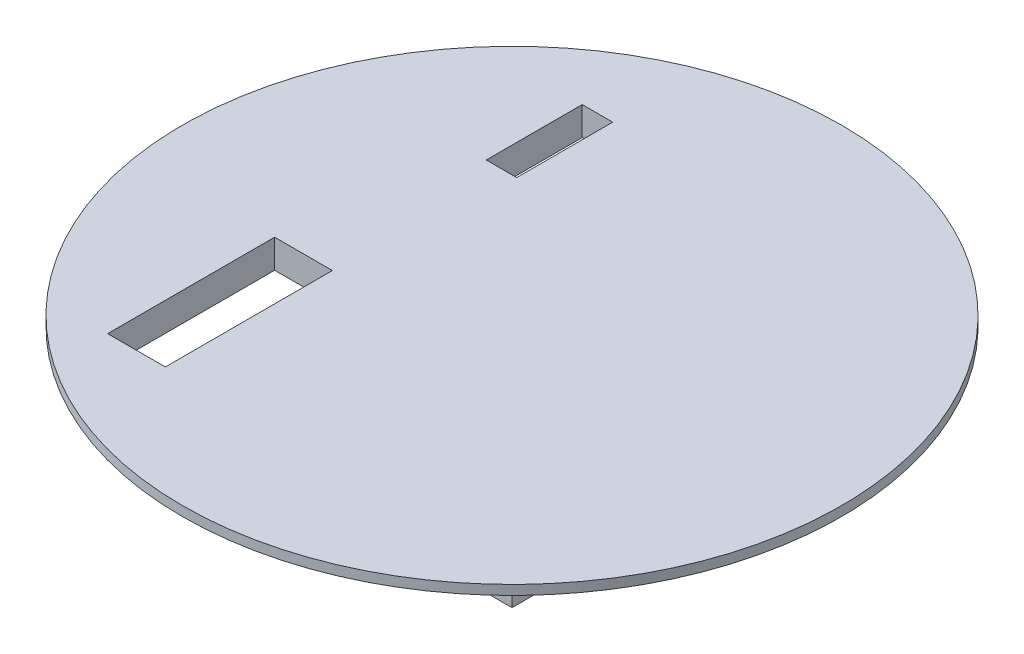
ISO-10303-21;
HEADER;
FILE_DESCRIPTION(('STEP AP214'),'2;1');
FILE_NAME('part.step','',(''),(''),'','','');
FILE_SCHEMA(('AUTOMOTIVE_DESIGN { 1 0 10303 214 1 1 1 1 }'));
ENDSEC;
DATA;
#1=APPLICATION_CONTEXT('core data for automotive mechanical design processes');
#2=APPLICATION_PROTOCOL_DEFINITION('international standard','automotive_design',2000,#1);
#3=PRODUCT_CONTEXT('',#1,'mechanical');
#4=PRODUCT('Part','Part','',(#3));
#5=PRODUCT_RELATED_PRODUCT_CATEGORY('part','',(#4));
#6=PRODUCT_DEFINITION_FORMATION('','',#4);
#7=PRODUCT_DEFINITION_CONTEXT('part definition',#1,'design');
#8=PRODUCT_DEFINITION('design','',#6,#7);
#9=PRODUCT_DEFINITION_SHAPE('','',#8);
#10=(LENGTH_UNIT() NAMED_UNIT(*) SI_UNIT(.MILLI.,.METRE.));
#11=(NAMED_UNIT(*) PLANE_ANGLE_UNIT() SI_UNIT($,.RADIAN.));
#12=(NAMED_UNIT(*) SI_UNIT($,.STERADIAN.) SOLID_ANGLE_UNIT());
#13=UNCERTAINTY_MEASURE_WITH_UNIT(LENGTH_MEASURE(1.E-05),#10,'distance_accuracy_value','');
#14=(GEOMETRIC_REPRESENTATION_CONTEXT(3) GLOBAL_UNCERTAINTY_ASSIGNED_CONTEXT((#13)) GLOBAL_UNIT_ASSIGNED_CONTEXT((#10,
#11,#12)) REPRESENTATION_CONTEXT('',''));
#15=CARTESIAN_POINT('',(0.,0.,0.));
#16=DIRECTION('',(0.,0.,1.));
#17=DIRECTION('',(1.,0.,0.));
#18=AXIS2_PLACEMENT_3D('',#15,#16,#17);
#19=CARTESIAN_POINT('',(0.,0.,0.));
#20=DIRECTION('',(0.,-1.,0.));
#21=DIRECTION('',(0.,0.,-1.));
#22=AXIS2_PLACEMENT_3D('',#19,#20,#21);
#23=PLANE('',#22);
#24=DIRECTION('',(0.,0.,-1.));
#25=VECTOR('',#24,1.);
#26=CARTESIAN_POINT('',(23.5,0.,23.5));
#27=LINE('',#26,#25);
#28=CARTESIAN_POINT('',(23.5,0.,23.5));
#29=VERTEX_POINT('',#28);
#30=CARTESIAN_POINT('',(23.5,0.,-23.5));
#31=VERTEX_POINT('',#30);
#32=EDGE_CURVE('E139',#29,#31,#27,.T.);
#33=ORIENTED_EDGE('',*,*,#32,.F.);
#34=DIRECTION('',(1.,0.,0.));
#35=VECTOR('',#34,1.);
#36=CARTESIAN_POINT('',(-23.5,0.,23.5));
#37=LINE('',#36,#35);
#38=CARTESIAN_POINT('',(-23.5,0.,23.5));
#39=VERTEX_POINT('',#38);
#40=EDGE_CURVE('E236',#39,#29,#37,.T.);
#41=ORIENTED_EDGE('',*,*,#40,.F.);
#42=DIRECTION('',(0.,0.,1.));
#43=VECTOR('',#42,1.);
#44=CARTESIAN_POINT('',(-23.5,0.,23.5));
#45=LINE('',#44,#43);
#46=CARTESIAN_POINT('',(-23.5,0.,-23.5));
#47=VERTEX_POINT('',#46);
#48=EDGE_CURVE('E255',#47,#39,#45,.T.);
#49=ORIENTED_EDGE('',*,*,#48,.F.);
#50=DIRECTION('',(-1.,0.,0.));
#51=VECTOR('',#50,1.);
#52=CARTESIAN_POINT('',(-23.5,0.,-23.5));
#53=LINE('',#52,#51);
#54=EDGE_CURVE('E252',#31,#47,#53,.T.);
#55=ORIENTED_EDGE('',*,*,#54,.F.);
#56=EDGE_LOOP('',(#33,#41,#49,#55));
#57=FACE_BOUND('',#56,.T.);
#58=DIRECTION('',(-1.,0.,0.));
#59=VECTOR('',#58,1.);
#60=CARTESIAN_POINT('',(-19.5112788593671,0.,5.33775261237884));
#61=LINE('',#60,#59);
#62=CARTESIAN_POINT('',(-13.4703518775299,0.,5.33775261237884));
#63=VERTEX_POINT('',#62);
#64=CARTESIAN_POINT('',(-19.5112788593671,0.,5.33775261237884));
#65=VERTEX_POINT('',#64);
#66=EDGE_CURVE('E220',#63,#65,#61,.T.);
#67=ORIENTED_EDGE('',*,*,#66,.T.);
#68=DIRECTION('',(0.,0.,1.));
#69=VECTOR('',#68,1.);
#70=CARTESIAN_POINT('',(-19.5112788593671,0.,22.8198291810288));
#71=LINE('',#70,#69);
#72=CARTESIAN_POINT('',(-19.5112788593671,0.,22.8198291810288));
#73=VERTEX_POINT('',#72);
#74=EDGE_CURVE('E63',#65,#73,#71,.T.);
#75=ORIENTED_EDGE('',*,*,#74,.T.);
#76=DIRECTION('',(1.,0.,0.));
#77=VECTOR('',#76,1.);
#78=CARTESIAN_POINT('',(-19.5112788593671,0.,22.8198291810288));
#79=LINE('',#78,#77);
#80=CARTESIAN_POINT('',(-13.4703518775299,0.,22.8198291810288));
#81=VERTEX_POINT('',#80);
#82=EDGE_CURVE('E137',#73,#81,#79,.T.);
#83=ORIENTED_EDGE('',*,*,#82,.T.);
#84=DIRECTION('',(0.,0.,-1.));
#85=VECTOR('',#84,1.);
#86=CARTESIAN_POINT('',(-13.4703518775299,0.,22.8198291810288));
#87=LINE('',#86,#85);
#88=EDGE_CURVE('E216',#81,#63,#87,.T.);
#89=ORIENTED_EDGE('',*,*,#88,.T.);
#90=EDGE_LOOP('',(#67,#75,#83,#89));
#91=FACE_BOUND('',#90,.T.);
#92=DIRECTION('',(-1.,0.,0.));
#93=VECTOR('',#92,1.);
#94=CARTESIAN_POINT('',(-15.4354197594713,0.,-22.7879720045948));
#95=LINE('',#94,#93);
#96=CARTESIAN_POINT('',(-12.2456539562737,0.,-22.7879720045948));
#97=VERTEX_POINT('',#96);
#98=CARTESIAN_POINT('',(-15.4354197594713,0.,-22.7879720045948));
#99=VERTEX_POINT('',#98);
#100=EDGE_CURVE('E196',#97,#99,#95,.T.);
#101=ORIENTED_EDGE('',*,*,#100,.T.);
#102=DIRECTION('',(0.,0.,1.));
#103=VECTOR('',#102,1.);
#104=CARTESIAN_POINT('',(-15.4354197594713,0.,-22.7879720045948));
#105=LINE('',#104,#103);
#106=CARTESIAN_POINT('',(-15.4354197594713,0.,-12.7402097245224));
#107=VERTEX_POINT('',#106);
#108=EDGE_CURVE('E55',#99,#107,#105,.T.);
#109=ORIENTED_EDGE('',*,*,#108,.T.);
#110=DIRECTION('',(1.,0.,0.));
#111=VECTOR('',#110,1.);
#112=CARTESIAN_POINT('',(-15.4354197594713,0.,-12.7402097245224));
#113=LINE('',#112,#111);
#114=CARTESIAN_POINT('',(-12.2456539562737,0.,-12.7402097245224));
#115=VERTEX_POINT('',#114);
#116=EDGE_CURVE('E188',#107,#115,#113,.T.);
#117=ORIENTED_EDGE('',*,*,#116,.T.);
#118=DIRECTION('',(0.,0.,-1.));
#119=VECTOR('',#118,1.);
#120=CARTESIAN_POINT('',(-12.2456539562737,0.,-22.7879720045948));
#121=LINE('',#120,#119);
#122=EDGE_CURVE('E192',#115,#97,#121,.T.);
#123=ORIENTED_EDGE('',*,*,#122,.T.);
#124=EDGE_LOOP('',(#101,#109,#117,#123));
#125=FACE_BOUND('',#124,.T.);
#126=ADVANCED_FACE('F39',(#57,#91,#125),#23,.T.);
#127=CARTESIAN_POINT('',(23.5,2.,23.5));
#128=DIRECTION('',(-1.,0.,0.));
#129=DIRECTION('',(0.,0.,1.));
#130=AXIS2_PLACEMENT_3D('',#127,#128,#129);
#131=PLANE('',#130);
#132=ORIENTED_EDGE('',*,*,#32,.T.);
#133=DIRECTION('',(0.,-1.,0.));
#134=VECTOR('',#133,1.);
#135=CARTESIAN_POINT('',(23.5,2.,-23.5));
#136=LINE('',#135,#134);
#137=CARTESIAN_POINT('',(23.5,2.,-23.5));
#138=VERTEX_POINT('',#137);
#139=EDGE_CURVE('E11',#138,#31,#136,.T.);
#140=ORIENTED_EDGE('',*,*,#139,.F.);
#141=DIRECTION('',(0.,0.,-1.));
#142=VECTOR('',#141,1.);
#143=CARTESIAN_POINT('',(23.5,2.,23.5));
#144=LINE('',#143,#142);
#145=CARTESIAN_POINT('',(23.5,2.,23.5));
#146=VERTEX_POINT('',#145);
#147=EDGE_CURVE('E231',#146,#138,#144,.T.);
#148=ORIENTED_EDGE('',*,*,#147,.F.);
#149=DIRECTION('',(0.,-1.,0.));
#150=VECTOR('',#149,1.);
#151=CARTESIAN_POINT('',(23.5,2.,23.5));
#152=LINE('',#151,#150);
#153=EDGE_CURVE('E248',#146,#29,#152,.T.);
#154=ORIENTED_EDGE('',*,*,#153,.T.);
#155=EDGE_LOOP('',(#132,#140,#148,#154));
#156=FACE_BOUND('',#155,.T.);
#157=ADVANCED_FACE('F41',(#156),#131,.F.);
#158=CARTESIAN_POINT('',(-23.5,2.,-23.5));
#159=DIRECTION('',(0.,0.,1.));
#160=DIRECTION('',(1.,0.,0.));
#161=AXIS2_PLACEMENT_3D('',#158,#159,#160);
#162=PLANE('',#161);
#163=ORIENTED_EDGE('',*,*,#54,.T.);
#164=DIRECTION('',(0.,-1.,0.));
#165=VECTOR('',#164,1.);
#166=CARTESIAN_POINT('',(-23.5,2.,-23.5));
#167=LINE('',#166,#165);
#168=CARTESIAN_POINT('',(-23.5,2.,-23.5));
#169=VERTEX_POINT('',#168);
#170=EDGE_CURVE('E48',#169,#47,#167,.T.);
#171=ORIENTED_EDGE('',*,*,#170,.F.);
#172=DIRECTION('',(-1.,0.,0.));
#173=VECTOR('',#172,1.);
#174=CARTESIAN_POINT('',(-23.5,2.,-23.5));
#175=LINE('',#174,#173);
#176=EDGE_CURVE('E235',#138,#169,#175,.T.);
#177=ORIENTED_EDGE('',*,*,#176,.F.);
#178=ORIENTED_EDGE('',*,*,#139,.T.);
#179=EDGE_LOOP('',(#163,#171,#177,#178));
#180=FACE_BOUND('',#179,.T.);
#181=ADVANCED_FACE('F285',(#180),#162,.F.);
#182=CARTESIAN_POINT('',(-23.5,2.,23.5));
#183=DIRECTION('',(1.,0.,0.));
#184=DIRECTION('',(0.,0.,-1.));
#185=AXIS2_PLACEMENT_3D('',#182,#183,#184);
#186=PLANE('',#185);
#187=ORIENTED_EDGE('',*,*,#48,.T.);
#188=DIRECTION('',(0.,-1.,0.));
#189=VECTOR('',#188,1.);
#190=CARTESIAN_POINT('',(-23.5,2.,23.5));
#191=LINE('',#190,#189);
#192=CARTESIAN_POINT('',(-23.5,2.,23.5));
#193=VERTEX_POINT('',#192);
#194=EDGE_CURVE('E263',#193,#39,#191,.T.);
#195=ORIENTED_EDGE('',*,*,#194,.F.);
#196=DIRECTION('',(0.,0.,1.));
#197=VECTOR('',#196,1.);
#198=CARTESIAN_POINT('',(-23.5,2.,23.5));
#199=LINE('',#198,#197);
#200=EDGE_CURVE('E240',#169,#193,#199,.T.);
#201=ORIENTED_EDGE('',*,*,#200,.F.);
#202=ORIENTED_EDGE('',*,*,#170,.T.);
#203=EDGE_LOOP('',(#187,#195,#201,#202));
#204=FACE_BOUND('',#203,.T.);
#205=ADVANCED_FACE('F271',(#204),#186,.F.);
#206=CARTESIAN_POINT('',(-23.5,2.,23.5));
#207=DIRECTION('',(0.,0.,-1.));
#208=DIRECTION('',(-1.,0.,0.));
#209=AXIS2_PLACEMENT_3D('',#206,#207,#208);
#210=PLANE('',#209);
#211=ORIENTED_EDGE('',*,*,#40,.T.);
#212=ORIENTED_EDGE('',*,*,#153,.F.);
#213=DIRECTION('',(1.,0.,0.));
#214=VECTOR('',#213,1.);
#215=CARTESIAN_POINT('',(-23.5,2.,23.5));
#216=LINE('',#215,#214);
#217=EDGE_CURVE('E244',#193,#146,#216,.T.);
#218=ORIENTED_EDGE('',*,*,#217,.F.);
#219=ORIENTED_EDGE('',*,*,#194,.T.);
#220=EDGE_LOOP('',(#211,#212,#218,#219));
#221=FACE_BOUND('',#220,.T.);
#222=ADVANCED_FACE('F279',(#221),#210,.F.);
#223=CARTESIAN_POINT('',(-19.5112788593671,2.,22.8198291810288));
#224=DIRECTION('',(1.,0.,0.));
#225=DIRECTION('',(0.,0.,-1.));
#226=AXIS2_PLACEMENT_3D('',#223,#224,#225);
#227=PLANE('',#226);
#228=ORIENTED_EDGE('',*,*,#74,.F.);
#229=DIRECTION('',(0.,-1.,0.));
#230=VECTOR('',#229,1.);
#231=CARTESIAN_POINT('',(-19.5112788593671,2.,5.33775261237884));
#232=LINE('',#231,#230);
#233=CARTESIAN_POINT('',(-19.5112788593671,3.,5.33775261237884));
#234=VERTEX_POINT('',#233);
#235=EDGE_CURVE('E145',#234,#65,#232,.T.);
#236=ORIENTED_EDGE('',*,*,#235,.F.);
#237=DIRECTION('',(0.,0.,1.));
#238=VECTOR('',#237,1.);
#239=CARTESIAN_POINT('',(-19.5112788593671,3.,5.33775261237884));
#240=LINE('',#239,#238);
#241=CARTESIAN_POINT('',(-19.5112788593671,3.,22.8198291810288));
#242=VERTEX_POINT('',#241);
#243=EDGE_CURVE('E143',#234,#242,#240,.T.);
#244=ORIENTED_EDGE('',*,*,#243,.T.);
#245=DIRECTION('',(0.,-1.,0.));
#246=VECTOR('',#245,1.);
#247=CARTESIAN_POINT('',(-19.5112788593671,2.,22.8198291810288));
#248=LINE('',#247,#246);
#249=EDGE_CURVE('E130',#242,#73,#248,.T.);
#250=ORIENTED_EDGE('',*,*,#249,.T.);
#251=EDGE_LOOP('',(#228,#236,#244,#250));
#252=FACE_BOUND('',#251,.T.);
#253=ADVANCED_FACE('F144',(#252),#227,.T.);
#254=CARTESIAN_POINT('',(-19.5112788593671,2.,22.8198291810288));
#255=DIRECTION('',(0.,0.,-1.));
#256=DIRECTION('',(-1.,0.,0.));
#257=AXIS2_PLACEMENT_3D('',#254,#255,#256);
#258=PLANE('',#257);
#259=ORIENTED_EDGE('',*,*,#82,.F.);
#260=ORIENTED_EDGE('',*,*,#249,.F.);
#261=DIRECTION('',(1.,0.,0.));
#262=VECTOR('',#261,1.);
#263=CARTESIAN_POINT('',(-19.5112788593671,3.,22.8198291810288));
#264=LINE('',#263,#262);
#265=CARTESIAN_POINT('',(-13.4703518775299,3.,22.8198291810288));
#266=VERTEX_POINT('',#265);
#267=EDGE_CURVE('E134',#242,#266,#264,.T.);
#268=ORIENTED_EDGE('',*,*,#267,.T.);
#269=DIRECTION('',(0.,-1.,0.));
#270=VECTOR('',#269,1.);
#271=CARTESIAN_POINT('',(-13.4703518775299,2.,22.8198291810288));
#272=LINE('',#271,#270);
#273=EDGE_CURVE('E140',#266,#81,#272,.T.);
#274=ORIENTED_EDGE('',*,*,#273,.T.);
#275=EDGE_LOOP('',(#259,#260,#268,#274));
#276=FACE_BOUND('',#275,.T.);
#277=ADVANCED_FACE('F132',(#276),#258,.T.);
#278=CARTESIAN_POINT('',(-13.4703518775299,2.,22.8198291810288));
#279=DIRECTION('',(-1.,0.,0.));
#280=DIRECTION('',(0.,0.,1.));
#281=AXIS2_PLACEMENT_3D('',#278,#279,#280);
#282=PLANE('',#281);
#283=ORIENTED_EDGE('',*,*,#88,.F.);
#284=ORIENTED_EDGE('',*,*,#273,.F.);
#285=DIRECTION('',(0.,0.,-1.));
#286=VECTOR('',#285,1.);
#287=CARTESIAN_POINT('',(-13.4703518775299,3.,5.33775261237884));
#288=LINE('',#287,#286);
#289=CARTESIAN_POINT('',(-13.4703518775299,3.,5.33775261237884));
#290=VERTEX_POINT('',#289);
#291=EDGE_CURVE('E153',#266,#290,#288,.T.);
#292=ORIENTED_EDGE('',*,*,#291,.T.);
#293=DIRECTION('',(0.,-1.,0.));
#294=VECTOR('',#293,1.);
#295=CARTESIAN_POINT('',(-13.4703518775299,2.,5.33775261237884));
#296=LINE('',#295,#294);
#297=EDGE_CURVE('E226',#290,#63,#296,.T.);
#298=ORIENTED_EDGE('',*,*,#297,.T.);
#299=EDGE_LOOP('',(#283,#284,#292,#298));
#300=FACE_BOUND('',#299,.T.);
#301=ADVANCED_FACE('F306',(#300),#282,.T.);
#302=CARTESIAN_POINT('',(-19.5112788593671,2.,5.33775261237884));
#303=DIRECTION('',(0.,0.,1.));
#304=DIRECTION('',(1.,0.,0.));
#305=AXIS2_PLACEMENT_3D('',#302,#303,#304);
#306=PLANE('',#305);
#307=ORIENTED_EDGE('',*,*,#66,.F.);
#308=ORIENTED_EDGE('',*,*,#297,.F.);
#309=DIRECTION('',(-1.,0.,0.));
#310=VECTOR('',#309,1.);
#311=CARTESIAN_POINT('',(-19.5112788593671,3.,5.33775261237884));
#312=LINE('',#311,#310);
#313=EDGE_CURVE('E157',#290,#234,#312,.T.);
#314=ORIENTED_EDGE('',*,*,#313,.T.);
#315=ORIENTED_EDGE('',*,*,#235,.T.);
#316=EDGE_LOOP('',(#307,#308,#314,#315));
#317=FACE_BOUND('',#316,.T.);
#318=ADVANCED_FACE('F310',(#317),#306,.T.);
#319=CARTESIAN_POINT('',(-15.4354197594713,2.,-22.7879720045948));
#320=DIRECTION('',(1.,0.,0.));
#321=DIRECTION('',(0.,0.,-1.));
#322=AXIS2_PLACEMENT_3D('',#319,#320,#321);
#323=PLANE('',#322);
#324=ORIENTED_EDGE('',*,*,#108,.F.);
#325=DIRECTION('',(0.,-1.,0.));
#326=VECTOR('',#325,1.);
#327=CARTESIAN_POINT('',(-15.4354197594713,2.,-22.7879720045948));
#328=LINE('',#327,#326);
#329=CARTESIAN_POINT('',(-15.4354197594713,3.,-22.7879720045948));
#330=VERTEX_POINT('',#329);
#331=EDGE_CURVE('E200',#330,#99,#328,.T.);
#332=ORIENTED_EDGE('',*,*,#331,.F.);
#333=DIRECTION('',(0.,0.,1.));
#334=VECTOR('',#333,1.);
#335=CARTESIAN_POINT('',(-15.4354197594713,3.,-22.7879720045948));
#336=LINE('',#335,#334);
#337=CARTESIAN_POINT('',(-15.4354197594713,3.,-12.7402097245224));
#338=VERTEX_POINT('',#337);
#339=EDGE_CURVE('E162',#330,#338,#336,.T.);
#340=ORIENTED_EDGE('',*,*,#339,.T.);
#341=DIRECTION('',(0.,-1.,0.));
#342=VECTOR('',#341,1.);
#343=CARTESIAN_POINT('',(-15.4354197594713,2.,-12.7402097245224));
#344=LINE('',#343,#342);
#345=EDGE_CURVE('E209',#338,#107,#344,.T.);
#346=ORIENTED_EDGE('',*,*,#345,.T.);
#347=EDGE_LOOP('',(#324,#332,#340,#346));
#348=FACE_BOUND('',#347,.T.);
#349=ADVANCED_FACE('F316',(#348),#323,.T.);
#350=CARTESIAN_POINT('',(-15.4354197594713,2.,-12.7402097245224));
#351=DIRECTION('',(0.,0.,-1.));
#352=DIRECTION('',(-1.,0.,0.));
#353=AXIS2_PLACEMENT_3D('',#350,#351,#352);
#354=PLANE('',#353);
#355=ORIENTED_EDGE('',*,*,#116,.F.);
#356=ORIENTED_EDGE('',*,*,#345,.F.);
#357=DIRECTION('',(1.,0.,0.));
#358=VECTOR('',#357,1.);
#359=CARTESIAN_POINT('',(-15.4354197594713,3.,-12.7402097245224));
#360=LINE('',#359,#358);
#361=CARTESIAN_POINT('',(-12.2456539562737,3.,-12.7402097245224));
#362=VERTEX_POINT('',#361);
#363=EDGE_CURVE('E166',#338,#362,#360,.T.);
#364=ORIENTED_EDGE('',*,*,#363,.T.);
#365=DIRECTION('',(0.,-1.,0.));
#366=VECTOR('',#365,1.);
#367=CARTESIAN_POINT('',(-12.2456539562737,2.,-12.7402097245224));
#368=LINE('',#367,#366);
#369=EDGE_CURVE('E206',#362,#115,#368,.T.);
#370=ORIENTED_EDGE('',*,*,#369,.T.);
#371=EDGE_LOOP('',(#355,#356,#364,#370));
#372=FACE_BOUND('',#371,.T.);
#373=ADVANCED_FACE('F320',(#372),#354,.T.);
#374=CARTESIAN_POINT('',(-12.2456539562737,2.,-22.7879720045948));
#375=DIRECTION('',(-1.,0.,0.));
#376=DIRECTION('',(0.,0.,1.));
#377=AXIS2_PLACEMENT_3D('',#374,#375,#376);
#378=PLANE('',#377);
#379=ORIENTED_EDGE('',*,*,#122,.F.);
#380=ORIENTED_EDGE('',*,*,#369,.F.);
#381=DIRECTION('',(0.,0.,-1.));
#382=VECTOR('',#381,1.);
#383=CARTESIAN_POINT('',(-12.2456539562737,3.,-22.7879720045948));
#384=LINE('',#383,#382);
#385=CARTESIAN_POINT('',(-12.2456539562737,3.,-22.7879720045948));
#386=VERTEX_POINT('',#385);
#387=EDGE_CURVE('E170',#362,#386,#384,.T.);
#388=ORIENTED_EDGE('',*,*,#387,.T.);
#389=DIRECTION('',(0.,-1.,0.));
#390=VECTOR('',#389,1.);
#391=CARTESIAN_POINT('',(-12.2456539562737,2.,-22.7879720045948));
#392=LINE('',#391,#390);
#393=EDGE_CURVE('E203',#386,#97,#392,.T.);
#394=ORIENTED_EDGE('',*,*,#393,.T.);
#395=EDGE_LOOP('',(#379,#380,#388,#394));
#396=FACE_BOUND('',#395,.T.);
#397=ADVANCED_FACE('F323',(#396),#378,.T.);
#398=CARTESIAN_POINT('',(-15.4354197594713,2.,-22.7879720045948));
#399=DIRECTION('',(0.,0.,1.));
#400=DIRECTION('',(1.,0.,0.));
#401=AXIS2_PLACEMENT_3D('',#398,#399,#400);
#402=PLANE('',#401);
#403=ORIENTED_EDGE('',*,*,#100,.F.);
#404=ORIENTED_EDGE('',*,*,#393,.F.);
#405=DIRECTION('',(-1.,0.,0.));
#406=VECTOR('',#405,1.);
#407=CARTESIAN_POINT('',(-15.4354197594713,3.,-22.7879720045948));
#408=LINE('',#407,#406);
#409=EDGE_CURVE('E174',#386,#330,#408,.T.);
#410=ORIENTED_EDGE('',*,*,#409,.T.);
#411=ORIENTED_EDGE('',*,*,#331,.T.);
#412=EDGE_LOOP('',(#403,#404,#410,#411));
#413=FACE_BOUND('',#412,.T.);
#414=ADVANCED_FACE('F327',(#413),#402,.T.);
#415=CARTESIAN_POINT('',(0.,2.,0.));
#416=DIRECTION('',(0.,1.,0.));
#417=DIRECTION('',(0.,0.,1.));
#418=AXIS2_PLACEMENT_3D('',#415,#416,#417);
#419=PLANE('',#418);
#420=CARTESIAN_POINT('',(0.,2.,0.));
#421=DIRECTION('',(0.,1.,0.));
#422=DIRECTION('',(0.,0.,1.));
#423=AXIS2_PLACEMENT_3D('',#420,#421,#422);
#424=CIRCLE('',#423,34.5);
#425=CARTESIAN_POINT('',(0.,2.,34.5));
#426=VERTEX_POINT('',#425);
#427=EDGE_CURVE('E178',#426,#426,#424,.T.);
#428=ORIENTED_EDGE('',*,*,#427,.F.);
#429=EDGE_LOOP('',(#428));
#430=FACE_BOUND('',#429,.T.);
#431=ORIENTED_EDGE('',*,*,#217,.T.);
#432=ORIENTED_EDGE('',*,*,#147,.T.);
#433=ORIENTED_EDGE('',*,*,#176,.T.);
#434=ORIENTED_EDGE('',*,*,#200,.T.);
#435=EDGE_LOOP('',(#431,#432,#433,#434));
#436=FACE_BOUND('',#435,.T.);
#437=ADVANCED_FACE('F284',(#430,#436),#419,.F.);
#438=CARTESIAN_POINT('',(0.,3.,0.));
#439=DIRECTION('',(0.,1.,0.));
#440=DIRECTION('',(0.,0.,1.));
#441=AXIS2_PLACEMENT_3D('',#438,#439,#440);
#442=PLANE('',#441);
#443=CARTESIAN_POINT('',(0.,3.,0.));
#444=DIRECTION('',(0.,1.,0.));
#445=DIRECTION('',(0.,0.,1.));
#446=AXIS2_PLACEMENT_3D('',#443,#444,#445);
#447=CIRCLE('',#446,34.5);
#448=CARTESIAN_POINT('',(0.,3.,34.5));
#449=VERTEX_POINT('',#448);
#450=EDGE_CURVE('E179',#449,#449,#447,.T.);
#451=ORIENTED_EDGE('',*,*,#450,.T.);
#452=EDGE_LOOP('',(#451));
#453=FACE_BOUND('',#452,.T.);
#454=ORIENTED_EDGE('',*,*,#363,.F.);
#455=ORIENTED_EDGE('',*,*,#339,.F.);
#456=ORIENTED_EDGE('',*,*,#409,.F.);
#457=ORIENTED_EDGE('',*,*,#387,.F.);
#458=EDGE_LOOP('',(#454,#455,#456,#457));
#459=FACE_BOUND('',#458,.T.);
#460=ORIENTED_EDGE('',*,*,#267,.F.);
#461=ORIENTED_EDGE('',*,*,#243,.F.);
#462=ORIENTED_EDGE('',*,*,#313,.F.);
#463=ORIENTED_EDGE('',*,*,#291,.F.);
#464=EDGE_LOOP('',(#460,#461,#462,#463));
#465=FACE_BOUND('',#464,.T.);
#466=ADVANCED_FACE('F151',(#453,#459,#465),#442,.T.);
#467=CARTESIAN_POINT('',(0.,3.,0.));
#468=DIRECTION('',(0.,-1.,0.));
#469=DIRECTION('',(0.,0.,-1.));
#470=AXIS2_PLACEMENT_3D('',#467,#468,#469);
#471=CYLINDRICAL_SURFACE('',#470,34.5);
#472=ORIENTED_EDGE('',*,*,#450,.F.);
#473=EDGE_LOOP('',(#472));
#474=FACE_BOUND('',#473,.T.);
#475=ORIENTED_EDGE('',*,*,#427,.T.);
#476=EDGE_LOOP('',(#475));
#477=FACE_BOUND('',#476,.T.);
#478=ADVANCED_FACE('F332',(#474,#477),#471,.T.);
#479=CLOSED_SHELL('',(#126,#157,#181,#205,#222,#253,#277,#301,#318,#349,#373,#397,#414,#437,
#466,#478));
#480=MANIFOLD_SOLID_BREP('B2',#479);
#481=ADVANCED_BREP_SHAPE_REPRESENTATION('',(#18,#480),#14);
#482=SHAPE_DEFINITION_REPRESENTATION(#9,#481);
ENDSEC;
END-ISO-10303-21;
